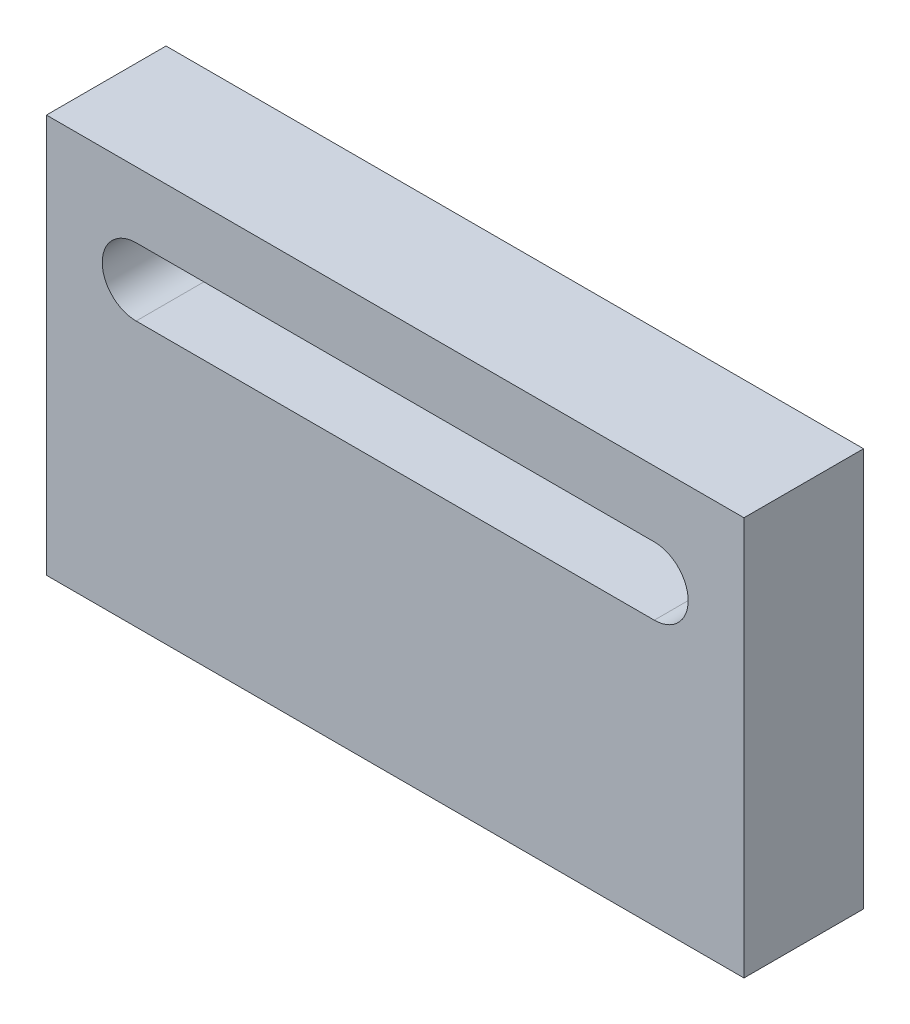
ISO-10303-21;
HEADER;
FILE_DESCRIPTION(('STEP AP214'),'2;1');
FILE_NAME('part.step','',(''),(''),'','','');
FILE_SCHEMA(('AUTOMOTIVE_DESIGN { 1 0 10303 214 1 1 1 1 }'));
ENDSEC;
DATA;
#1=APPLICATION_CONTEXT('core data for automotive mechanical design processes');
#2=APPLICATION_PROTOCOL_DEFINITION('international standard','automotive_design',2000,#1);
#3=PRODUCT_CONTEXT('',#1,'mechanical');
#4=PRODUCT('Part','Part','',(#3));
#5=PRODUCT_RELATED_PRODUCT_CATEGORY('part','',(#4));
#6=PRODUCT_DEFINITION_FORMATION('','',#4);
#7=PRODUCT_DEFINITION_CONTEXT('part definition',#1,'design');
#8=PRODUCT_DEFINITION('design','',#6,#7);
#9=PRODUCT_DEFINITION_SHAPE('','',#8);
#10=(LENGTH_UNIT() NAMED_UNIT(*) SI_UNIT(.MILLI.,.METRE.));
#11=(NAMED_UNIT(*) PLANE_ANGLE_UNIT() SI_UNIT($,.RADIAN.));
#12=(NAMED_UNIT(*) SI_UNIT($,.STERADIAN.) SOLID_ANGLE_UNIT());
#13=UNCERTAINTY_MEASURE_WITH_UNIT(LENGTH_MEASURE(1.E-05),#10,'distance_accuracy_value','');
#14=(GEOMETRIC_REPRESENTATION_CONTEXT(3) GLOBAL_UNCERTAINTY_ASSIGNED_CONTEXT((#13)) GLOBAL_UNIT_ASSIGNED_CONTEXT((#10,
#11,#12)) REPRESENTATION_CONTEXT('',''));
#15=CARTESIAN_POINT('',(0.,0.,0.));
#16=DIRECTION('',(0.,0.,1.));
#17=DIRECTION('',(1.,0.,0.));
#18=AXIS2_PLACEMENT_3D('',#15,#16,#17);
#19=CARTESIAN_POINT('',(0.,0.,6.));
#20=DIRECTION('',(0.,0.,1.));
#21=DIRECTION('',(1.,0.,0.));
#22=AXIS2_PLACEMENT_3D('',#19,#20,#21);
#23=PLANE('',#22);
#24=DIRECTION('',(0.,1.,0.));
#25=VECTOR('',#24,1.);
#26=CARTESIAN_POINT('',(17.5,10.,6.));
#27=LINE('',#26,#25);
#28=CARTESIAN_POINT('',(17.5,-10.,6.));
#29=VERTEX_POINT('',#28);
#30=CARTESIAN_POINT('',(17.5,10.,6.));
#31=VERTEX_POINT('',#30);
#32=EDGE_CURVE('E137',#29,#31,#27,.T.);
#33=ORIENTED_EDGE('',*,*,#32,.T.);
#34=DIRECTION('',(-1.,0.,0.));
#35=VECTOR('',#34,1.);
#36=CARTESIAN_POINT('',(-17.5,10.,6.));
#37=LINE('',#36,#35);
#38=CARTESIAN_POINT('',(-17.5,10.,6.));
#39=VERTEX_POINT('',#38);
#40=EDGE_CURVE('E140',#31,#39,#37,.T.);
#41=ORIENTED_EDGE('',*,*,#40,.T.);
#42=DIRECTION('',(0.,-1.,0.));
#43=VECTOR('',#42,1.);
#44=CARTESIAN_POINT('',(-17.5,10.,6.));
#45=LINE('',#44,#43);
#46=CARTESIAN_POINT('',(-17.5,-10.,6.));
#47=VERTEX_POINT('',#46);
#48=EDGE_CURVE('E143',#39,#47,#45,.T.);
#49=ORIENTED_EDGE('',*,*,#48,.T.);
#50=DIRECTION('',(1.,0.,0.));
#51=VECTOR('',#50,1.);
#52=CARTESIAN_POINT('',(-17.5,-10.,6.));
#53=LINE('',#52,#51);
#54=EDGE_CURVE('E145',#47,#29,#53,.T.);
#55=ORIENTED_EDGE('',*,*,#54,.T.);
#56=EDGE_LOOP('',(#33,#41,#49,#55));
#57=FACE_BOUND('',#56,.T.);
#58=CARTESIAN_POINT('',(-13.,5.,6.));
#59=DIRECTION('',(0.,0.,1.));
#60=DIRECTION('',(1.,0.,0.));
#61=AXIS2_PLACEMENT_3D('',#58,#59,#60);
#62=CIRCLE('',#61,1.7);
#63=CARTESIAN_POINT('',(-13.,6.7,6.));
#64=VERTEX_POINT('',#63);
#65=CARTESIAN_POINT('',(-13.,3.3,6.));
#66=VERTEX_POINT('',#65);
#67=EDGE_CURVE('E32',#64,#66,#62,.T.);
#68=ORIENTED_EDGE('',*,*,#67,.F.);
#69=DIRECTION('',(1.,0.,0.));
#70=VECTOR('',#69,1.);
#71=CARTESIAN_POINT('',(-13.,6.7,6.));
#72=LINE('',#71,#70);
#73=CARTESIAN_POINT('',(13.,6.7,6.));
#74=VERTEX_POINT('',#73);
#75=EDGE_CURVE('E116',#64,#74,#72,.T.);
#76=ORIENTED_EDGE('',*,*,#75,.T.);
#77=CARTESIAN_POINT('',(13.,5.,6.));
#78=DIRECTION('',(0.,0.,1.));
#79=DIRECTION('',(1.,0.,0.));
#80=AXIS2_PLACEMENT_3D('',#77,#78,#79);
#81=CIRCLE('',#80,1.7);
#82=CARTESIAN_POINT('',(13.,3.29999999999994,6.));
#83=VERTEX_POINT('',#82);
#84=EDGE_CURVE('E127',#83,#74,#81,.T.);
#85=ORIENTED_EDGE('',*,*,#84,.F.);
#86=DIRECTION('',(1.,0.,0.));
#87=VECTOR('',#86,1.);
#88=CARTESIAN_POINT('',(-13.,3.29999999999993,6.));
#89=LINE('',#88,#87);
#90=EDGE_CURVE('E109',#66,#83,#89,.T.);
#91=ORIENTED_EDGE('',*,*,#90,.F.);
#92=EDGE_LOOP('',(#68,#76,#85,#91));
#93=FACE_BOUND('',#92,.T.);
#94=ADVANCED_FACE('F17',(#57,#93),#23,.T.);
#95=CARTESIAN_POINT('',(17.5,10.,6.));
#96=DIRECTION('',(-1.,0.,0.));
#97=DIRECTION('',(0.,-1.,0.));
#98=AXIS2_PLACEMENT_3D('',#95,#96,#97);
#99=PLANE('',#98);
#100=DIRECTION('',(0.,1.,0.));
#101=VECTOR('',#100,1.);
#102=CARTESIAN_POINT('',(17.5,10.,0.));
#103=LINE('',#102,#101);
#104=CARTESIAN_POINT('',(17.5,-10.,0.));
#105=VERTEX_POINT('',#104);
#106=CARTESIAN_POINT('',(17.5,10.,0.));
#107=VERTEX_POINT('',#106);
#108=EDGE_CURVE('E136',#105,#107,#103,.T.);
#109=ORIENTED_EDGE('',*,*,#108,.T.);
#110=DIRECTION('',(0.,0.,-1.));
#111=VECTOR('',#110,1.);
#112=CARTESIAN_POINT('',(17.5,10.,6.));
#113=LINE('',#112,#111);
#114=EDGE_CURVE('E11',#31,#107,#113,.T.);
#115=ORIENTED_EDGE('',*,*,#114,.F.);
#116=ORIENTED_EDGE('',*,*,#32,.F.);
#117=DIRECTION('',(0.,0.,-1.));
#118=VECTOR('',#117,1.);
#119=CARTESIAN_POINT('',(17.5,-10.,6.));
#120=LINE('',#119,#118);
#121=EDGE_CURVE('E147',#29,#105,#120,.T.);
#122=ORIENTED_EDGE('',*,*,#121,.T.);
#123=EDGE_LOOP('',(#109,#115,#116,#122));
#124=FACE_BOUND('',#123,.T.);
#125=ADVANCED_FACE('F19',(#124),#99,.F.);
#126=CARTESIAN_POINT('',(-17.5,10.,6.));
#127=DIRECTION('',(0.,-1.,0.));
#128=DIRECTION('',(0.,0.,-1.));
#129=AXIS2_PLACEMENT_3D('',#126,#127,#128);
#130=PLANE('',#129);
#131=DIRECTION('',(-1.,0.,0.));
#132=VECTOR('',#131,1.);
#133=CARTESIAN_POINT('',(-17.5,10.,0.));
#134=LINE('',#133,#132);
#135=CARTESIAN_POINT('',(-17.5,10.,0.));
#136=VERTEX_POINT('',#135);
#137=EDGE_CURVE('E150',#107,#136,#134,.T.);
#138=ORIENTED_EDGE('',*,*,#137,.T.);
#139=DIRECTION('',(0.,0.,-1.));
#140=VECTOR('',#139,1.);
#141=CARTESIAN_POINT('',(-17.5,10.,6.));
#142=LINE('',#141,#140);
#143=EDGE_CURVE('E25',#39,#136,#142,.T.);
#144=ORIENTED_EDGE('',*,*,#143,.F.);
#145=ORIENTED_EDGE('',*,*,#40,.F.);
#146=ORIENTED_EDGE('',*,*,#114,.T.);
#147=EDGE_LOOP('',(#138,#144,#145,#146));
#148=FACE_BOUND('',#147,.T.);
#149=ADVANCED_FACE('F180',(#148),#130,.F.);
#150=CARTESIAN_POINT('',(-17.5,10.,6.));
#151=DIRECTION('',(1.,0.,0.));
#152=DIRECTION('',(0.,1.,0.));
#153=AXIS2_PLACEMENT_3D('',#150,#151,#152);
#154=PLANE('',#153);
#155=DIRECTION('',(0.,-1.,0.));
#156=VECTOR('',#155,1.);
#157=CARTESIAN_POINT('',(-17.5,10.,0.));
#158=LINE('',#157,#156);
#159=CARTESIAN_POINT('',(-17.5,-10.,0.));
#160=VERTEX_POINT('',#159);
#161=EDGE_CURVE('E152',#136,#160,#158,.T.);
#162=ORIENTED_EDGE('',*,*,#161,.T.);
#163=DIRECTION('',(0.,0.,-1.));
#164=VECTOR('',#163,1.);
#165=CARTESIAN_POINT('',(-17.5,-10.,6.));
#166=LINE('',#165,#164);
#167=EDGE_CURVE('E157',#47,#160,#166,.T.);
#168=ORIENTED_EDGE('',*,*,#167,.F.);
#169=ORIENTED_EDGE('',*,*,#48,.F.);
#170=ORIENTED_EDGE('',*,*,#143,.T.);
#171=EDGE_LOOP('',(#162,#168,#169,#170));
#172=FACE_BOUND('',#171,.T.);
#173=ADVANCED_FACE('F164',(#172),#154,.F.);
#174=CARTESIAN_POINT('',(-17.5,-10.,6.));
#175=DIRECTION('',(0.,1.,0.));
#176=DIRECTION('',(0.,0.,1.));
#177=AXIS2_PLACEMENT_3D('',#174,#175,#176);
#178=PLANE('',#177);
#179=CARTESIAN_POINT('',(7.5,-10.,3.));
#180=DIRECTION('',(0.,-1.,0.));
#181=DIRECTION('',(0.,0.,-1.));
#182=AXIS2_PLACEMENT_3D('',#179,#180,#181);
#183=CIRCLE('',#182,1.25);
#184=CARTESIAN_POINT('',(7.5,-10.,1.75));
#185=VERTEX_POINT('',#184);
#186=EDGE_CURVE('E99',#185,#185,#183,.T.);
#187=ORIENTED_EDGE('',*,*,#186,.F.);
#188=EDGE_LOOP('',(#187));
#189=FACE_BOUND('',#188,.T.);
#190=CARTESIAN_POINT('',(-7.5,-10.,3.));
#191=DIRECTION('',(0.,-1.,0.));
#192=DIRECTION('',(0.,0.,-1.));
#193=AXIS2_PLACEMENT_3D('',#190,#191,#192);
#194=CIRCLE('',#193,1.25);
#195=CARTESIAN_POINT('',(-7.5,-10.,1.75));
#196=VERTEX_POINT('',#195);
#197=EDGE_CURVE('E98',#196,#196,#194,.T.);
#198=ORIENTED_EDGE('',*,*,#197,.F.);
#199=EDGE_LOOP('',(#198));
#200=FACE_BOUND('',#199,.T.);
#201=DIRECTION('',(1.,0.,0.));
#202=VECTOR('',#201,1.);
#203=CARTESIAN_POINT('',(-17.5,-10.,0.));
#204=LINE('',#203,#202);
#205=EDGE_CURVE('E141',#160,#105,#204,.T.);
#206=ORIENTED_EDGE('',*,*,#205,.T.);
#207=ORIENTED_EDGE('',*,*,#121,.F.);
#208=ORIENTED_EDGE('',*,*,#54,.F.);
#209=ORIENTED_EDGE('',*,*,#167,.T.);
#210=EDGE_LOOP('',(#206,#207,#208,#209));
#211=FACE_BOUND('',#210,.T.);
#212=ADVANCED_FACE('F173',(#189,#200,#211),#178,.F.);
#213=CARTESIAN_POINT('',(0.,0.,0.));
#214=DIRECTION('',(0.,0.,1.));
#215=DIRECTION('',(1.,0.,0.));
#216=AXIS2_PLACEMENT_3D('',#213,#214,#215);
#217=PLANE('',#216);
#218=DIRECTION('',(1.,0.,0.));
#219=VECTOR('',#218,1.);
#220=CARTESIAN_POINT('',(-13.,3.3,0.));
#221=LINE('',#220,#219);
#222=CARTESIAN_POINT('',(-13.,3.3,0.));
#223=VERTEX_POINT('',#222);
#224=CARTESIAN_POINT('',(13.,3.3,0.));
#225=VERTEX_POINT('',#224);
#226=EDGE_CURVE('E111',#223,#225,#221,.T.);
#227=ORIENTED_EDGE('',*,*,#226,.T.);
#228=CARTESIAN_POINT('',(13.,5.,0.));
#229=DIRECTION('',(0.,0.,1.));
#230=DIRECTION('',(1.,0.,0.));
#231=AXIS2_PLACEMENT_3D('',#228,#229,#230);
#232=CIRCLE('',#231,1.7);
#233=CARTESIAN_POINT('',(13.,6.7,0.));
#234=VERTEX_POINT('',#233);
#235=EDGE_CURVE('E130',#225,#234,#232,.T.);
#236=ORIENTED_EDGE('',*,*,#235,.T.);
#237=DIRECTION('',(1.,0.,0.));
#238=VECTOR('',#237,1.);
#239=CARTESIAN_POINT('',(-13.,6.7,0.));
#240=LINE('',#239,#238);
#241=CARTESIAN_POINT('',(-13.,6.7,0.));
#242=VERTEX_POINT('',#241);
#243=EDGE_CURVE('E114',#242,#234,#240,.T.);
#244=ORIENTED_EDGE('',*,*,#243,.F.);
#245=CARTESIAN_POINT('',(-13.,5.,0.));
#246=DIRECTION('',(0.,0.,1.));
#247=DIRECTION('',(1.,0.,0.));
#248=AXIS2_PLACEMENT_3D('',#245,#246,#247);
#249=CIRCLE('',#248,1.7);
#250=EDGE_CURVE('E120',#242,#223,#249,.T.);
#251=ORIENTED_EDGE('',*,*,#250,.T.);
#252=EDGE_LOOP('',(#227,#236,#244,#251));
#253=FACE_BOUND('',#252,.T.);
#254=ORIENTED_EDGE('',*,*,#108,.F.);
#255=ORIENTED_EDGE('',*,*,#205,.F.);
#256=ORIENTED_EDGE('',*,*,#161,.F.);
#257=ORIENTED_EDGE('',*,*,#137,.F.);
#258=EDGE_LOOP('',(#254,#255,#256,#257));
#259=FACE_BOUND('',#258,.T.);
#260=ADVANCED_FACE('F170',(#253,#259),#217,.F.);
#261=CARTESIAN_POINT('',(13.,5.,6.));
#262=DIRECTION('',(0.,0.,1.));
#263=DIRECTION('',(1.,0.,0.));
#264=AXIS2_PLACEMENT_3D('',#261,#262,#263);
#265=CYLINDRICAL_SURFACE('',#264,1.7);
#266=ORIENTED_EDGE('',*,*,#235,.F.);
#267=DIRECTION('',(0.,0.,1.));
#268=VECTOR('',#267,1.);
#269=CARTESIAN_POINT('',(13.,3.3,6.));
#270=LINE('',#269,#268);
#271=EDGE_CURVE('E40',#83,#225,#270,.F.);
#272=ORIENTED_EDGE('',*,*,#271,.F.);
#273=ORIENTED_EDGE('',*,*,#84,.T.);
#274=DIRECTION('',(0.,0.,1.));
#275=VECTOR('',#274,1.);
#276=CARTESIAN_POINT('',(13.,6.7,6.));
#277=LINE('',#276,#275);
#278=EDGE_CURVE('E133',#234,#74,#277,.T.);
#279=ORIENTED_EDGE('',*,*,#278,.F.);
#280=EDGE_LOOP('',(#266,#272,#273,#279));
#281=FACE_BOUND('',#280,.T.);
#282=ADVANCED_FACE('F196',(#281),#265,.F.);
#283=CARTESIAN_POINT('',(-13.,5.,6.));
#284=DIRECTION('',(0.,0.,1.));
#285=DIRECTION('',(1.,0.,0.));
#286=AXIS2_PLACEMENT_3D('',#283,#284,#285);
#287=CYLINDRICAL_SURFACE('',#286,1.7);
#288=ORIENTED_EDGE('',*,*,#67,.T.);
#289=DIRECTION('',(0.,0.,1.));
#290=VECTOR('',#289,1.);
#291=CARTESIAN_POINT('',(-13.,3.3,6.));
#292=LINE('',#291,#290);
#293=EDGE_CURVE('E123',#223,#66,#292,.T.);
#294=ORIENTED_EDGE('',*,*,#293,.F.);
#295=ORIENTED_EDGE('',*,*,#250,.F.);
#296=DIRECTION('',(0.,0.,1.));
#297=VECTOR('',#296,1.);
#298=CARTESIAN_POINT('',(-13.,6.7,6.));
#299=LINE('',#298,#297);
#300=EDGE_CURVE('E125',#64,#242,#299,.F.);
#301=ORIENTED_EDGE('',*,*,#300,.F.);
#302=EDGE_LOOP('',(#288,#294,#295,#301));
#303=FACE_BOUND('',#302,.T.);
#304=ADVANCED_FACE('F229',(#303),#287,.F.);
#305=CARTESIAN_POINT('',(-13.,6.7,6.));
#306=DIRECTION('',(0.,1.,0.));
#307=DIRECTION('',(-1.,0.,0.));
#308=AXIS2_PLACEMENT_3D('',#305,#306,#307);
#309=PLANE('',#308);
#310=ORIENTED_EDGE('',*,*,#278,.T.);
#311=ORIENTED_EDGE('',*,*,#75,.F.);
#312=ORIENTED_EDGE('',*,*,#300,.T.);
#313=ORIENTED_EDGE('',*,*,#243,.T.);
#314=EDGE_LOOP('',(#310,#311,#312,#313));
#315=FACE_BOUND('',#314,.T.);
#316=ADVANCED_FACE('F227',(#315),#309,.F.);
#317=CARTESIAN_POINT('',(-13.,3.3,6.));
#318=DIRECTION('',(0.,-1.,0.));
#319=DIRECTION('',(1.,0.,0.));
#320=AXIS2_PLACEMENT_3D('',#317,#318,#319);
#321=PLANE('',#320);
#322=ORIENTED_EDGE('',*,*,#271,.T.);
#323=ORIENTED_EDGE('',*,*,#226,.F.);
#324=ORIENTED_EDGE('',*,*,#293,.T.);
#325=ORIENTED_EDGE('',*,*,#90,.T.);
#326=EDGE_LOOP('',(#322,#323,#324,#325));
#327=FACE_BOUND('',#326,.T.);
#328=ADVANCED_FACE('F219',(#327),#321,.F.);
#329=CARTESIAN_POINT('',(-7.5,-2.5,3.));
#330=DIRECTION('',(0.,-1.,0.));
#331=DIRECTION('',(0.,0.,-1.));
#332=AXIS2_PLACEMENT_3D('',#329,#330,#331);
#333=CONICAL_SURFACE('',#332,1.24999999999999,1.02974425867665);
#334=CARTESIAN_POINT('',(-7.5,-1.74892422621555,3.));
#335=VERTEX_POINT('',#334);
#336=VERTEX_LOOP('',#335);
#337=FACE_BOUND('',#336,.T.);
#338=CARTESIAN_POINT('',(-7.5,-2.5,3.));
#339=DIRECTION('',(0.,-1.,0.));
#340=DIRECTION('',(0.,0.,-1.));
#341=AXIS2_PLACEMENT_3D('',#338,#339,#340);
#342=CIRCLE('',#341,1.24999999999999);
#343=CARTESIAN_POINT('',(-7.5,-2.5,1.75000000000001));
#344=VERTEX_POINT('',#343);
#345=EDGE_CURVE('E102',#344,#344,#342,.T.);
#346=ORIENTED_EDGE('',*,*,#345,.T.);
#347=EDGE_LOOP('',(#346));
#348=FACE_BOUND('',#347,.T.);
#349=ADVANCED_FACE('F211',(#337,#348),#333,.F.);
#350=CARTESIAN_POINT('',(-7.5,-10.,3.));
#351=DIRECTION('',(0.,-1.,0.));
#352=DIRECTION('',(0.,0.,-1.));
#353=AXIS2_PLACEMENT_3D('',#350,#351,#352);
#354=CYLINDRICAL_SURFACE('',#353,1.24999999999999);
#355=ORIENTED_EDGE('',*,*,#345,.F.);
#356=EDGE_LOOP('',(#355));
#357=FACE_BOUND('',#356,.T.);
#358=ORIENTED_EDGE('',*,*,#197,.T.);
#359=EDGE_LOOP('',(#358));
#360=FACE_BOUND('',#359,.T.);
#361=ADVANCED_FACE('F92',(#357,#360),#354,.F.);
#362=CARTESIAN_POINT('',(7.5,-2.5,3.));
#363=DIRECTION('',(0.,-1.,0.));
#364=DIRECTION('',(0.,0.,-1.));
#365=AXIS2_PLACEMENT_3D('',#362,#363,#364);
#366=CONICAL_SURFACE('',#365,1.24999999999999,1.02974425867665);
#367=CARTESIAN_POINT('',(7.5,-1.74892422621555,3.));
#368=VERTEX_POINT('',#367);
#369=VERTEX_LOOP('',#368);
#370=FACE_BOUND('',#369,.T.);
#371=CARTESIAN_POINT('',(7.5,-2.5,3.));
#372=DIRECTION('',(0.,-1.,0.));
#373=DIRECTION('',(0.,0.,-1.));
#374=AXIS2_PLACEMENT_3D('',#371,#372,#373);
#375=CIRCLE('',#374,1.24999999999999);
#376=CARTESIAN_POINT('',(7.5,-2.5,1.75000000000001));
#377=VERTEX_POINT('',#376);
#378=EDGE_CURVE('E96',#377,#377,#375,.T.);
#379=ORIENTED_EDGE('',*,*,#378,.T.);
#380=EDGE_LOOP('',(#379));
#381=FACE_BOUND('',#380,.T.);
#382=ADVANCED_FACE('F88',(#370,#381),#366,.F.);
#383=CARTESIAN_POINT('',(7.5,-10.,3.));
#384=DIRECTION('',(0.,-1.,0.));
#385=DIRECTION('',(0.,0.,-1.));
#386=AXIS2_PLACEMENT_3D('',#383,#384,#385);
#387=CYLINDRICAL_SURFACE('',#386,1.24999999999999);
#388=ORIENTED_EDGE('',*,*,#378,.F.);
#389=EDGE_LOOP('',(#388));
#390=FACE_BOUND('',#389,.T.);
#391=ORIENTED_EDGE('',*,*,#186,.T.);
#392=EDGE_LOOP('',(#391));
#393=FACE_BOUND('',#392,.T.);
#394=ADVANCED_FACE('F91',(#390,#393),#387,.F.);
#395=CLOSED_SHELL('',(#94,#125,#149,#173,#212,#260,#282,#304,#316,#328,#349,#361,#382,#394));
#396=MANIFOLD_SOLID_BREP('B1',#395);
#397=ADVANCED_BREP_SHAPE_REPRESENTATION('',(#18,#396),#14);
#398=SHAPE_DEFINITION_REPRESENTATION(#9,#397);
ENDSEC;
END-ISO-10303-21;
